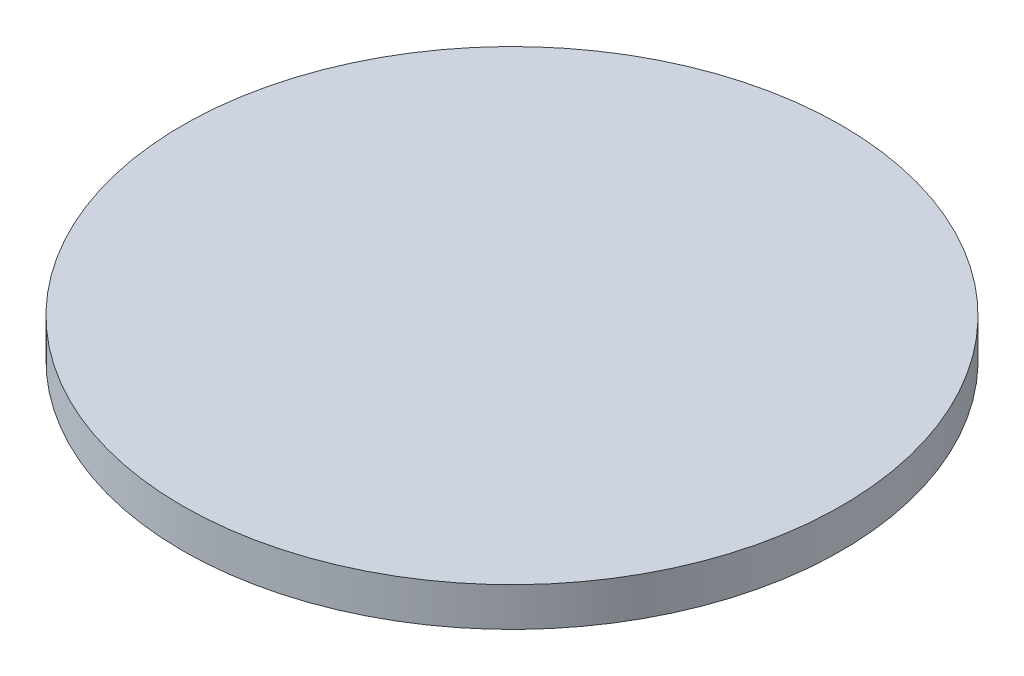
ISO-10303-21;
HEADER;
FILE_DESCRIPTION(('STEP AP214'),'2;1');
FILE_NAME('part.step','',(''),(''),'','','');
FILE_SCHEMA(('AUTOMOTIVE_DESIGN { 1 0 10303 214 1 1 1 1 }'));
ENDSEC;
DATA;
#1=APPLICATION_CONTEXT('core data for automotive mechanical design processes');
#2=APPLICATION_PROTOCOL_DEFINITION('international standard','automotive_design',2000,#1);
#3=PRODUCT_CONTEXT('',#1,'mechanical');
#4=PRODUCT('Part','Part','',(#3));
#5=PRODUCT_RELATED_PRODUCT_CATEGORY('part','',(#4));
#6=PRODUCT_DEFINITION_FORMATION('','',#4);
#7=PRODUCT_DEFINITION_CONTEXT('part definition',#1,'design');
#8=PRODUCT_DEFINITION('design','',#6,#7);
#9=PRODUCT_DEFINITION_SHAPE('','',#8);
#10=(LENGTH_UNIT() NAMED_UNIT(*) SI_UNIT(.MILLI.,.METRE.));
#11=(NAMED_UNIT(*) PLANE_ANGLE_UNIT() SI_UNIT($,.RADIAN.));
#12=(NAMED_UNIT(*) SI_UNIT($,.STERADIAN.) SOLID_ANGLE_UNIT());
#13=UNCERTAINTY_MEASURE_WITH_UNIT(LENGTH_MEASURE(1.E-05),#10,'distance_accuracy_value','');
#14=(GEOMETRIC_REPRESENTATION_CONTEXT(3) GLOBAL_UNCERTAINTY_ASSIGNED_CONTEXT((#13)) GLOBAL_UNIT_ASSIGNED_CONTEXT((#10,
#11,#12)) REPRESENTATION_CONTEXT('',''));
#15=CARTESIAN_POINT('',(0.,0.,0.));
#16=DIRECTION('',(0.,0.,1.));
#17=DIRECTION('',(1.,0.,0.));
#18=AXIS2_PLACEMENT_3D('',#15,#16,#17);
#19=CARTESIAN_POINT('',(0.,10.,0.));
#20=DIRECTION('',(0.,-1.,0.));
#21=DIRECTION('',(0.,0.,-1.));
#22=AXIS2_PLACEMENT_3D('',#19,#20,#21);
#23=CYLINDRICAL_SURFACE('',#22,85.);
#24=CARTESIAN_POINT('',(0.,10.,0.));
#25=DIRECTION('',(0.,1.,0.));
#26=DIRECTION('',(0.,0.,1.));
#27=AXIS2_PLACEMENT_3D('',#24,#25,#26);
#28=CIRCLE('',#27,85.);
#29=CARTESIAN_POINT('',(0.,10.,85.));
#30=VERTEX_POINT('',#29);
#31=EDGE_CURVE('E10',#30,#30,#28,.T.);
#32=ORIENTED_EDGE('',*,*,#31,.F.);
#33=EDGE_LOOP('',(#32));
#34=FACE_BOUND('',#33,.T.);
#35=CARTESIAN_POINT('',(0.,0.,0.));
#36=DIRECTION('',(0.,1.,0.));
#37=DIRECTION('',(0.,0.,1.));
#38=AXIS2_PLACEMENT_3D('',#35,#36,#37);
#39=CIRCLE('',#38,85.);
#40=CARTESIAN_POINT('',(0.,0.,85.));
#41=VERTEX_POINT('',#40);
#42=EDGE_CURVE('E36',#41,#41,#39,.T.);
#43=ORIENTED_EDGE('',*,*,#42,.T.);
#44=EDGE_LOOP('',(#43));
#45=FACE_BOUND('',#44,.T.);
#46=ADVANCED_FACE('F33',(#34,#45),#23,.T.);
#47=CARTESIAN_POINT('',(0.,10.,0.));
#48=DIRECTION('',(0.,1.,0.));
#49=DIRECTION('',(0.,0.,1.));
#50=AXIS2_PLACEMENT_3D('',#47,#48,#49);
#51=PLANE('',#50);
#52=ORIENTED_EDGE('',*,*,#31,.T.);
#53=EDGE_LOOP('',(#52));
#54=FACE_BOUND('',#53,.T.);
#55=ADVANCED_FACE('F48',(#54),#51,.T.);
#56=CARTESIAN_POINT('',(0.,0.,0.));
#57=DIRECTION('',(0.,1.,0.));
#58=DIRECTION('',(0.,0.,1.));
#59=AXIS2_PLACEMENT_3D('',#56,#57,#58);
#60=PLANE('',#59);
#61=ORIENTED_EDGE('',*,*,#42,.F.);
#62=EDGE_LOOP('',(#61));
#63=FACE_BOUND('',#62,.T.);
#64=ADVANCED_FACE('F46',(#63),#60,.F.);
#65=CLOSED_SHELL('',(#46,#55,#64));
#66=MANIFOLD_SOLID_BREP('B2',#65);
#67=ADVANCED_BREP_SHAPE_REPRESENTATION('',(#18,#66),#14);
#68=SHAPE_DEFINITION_REPRESENTATION(#9,#67);
ENDSEC;
END-ISO-10303-21;
